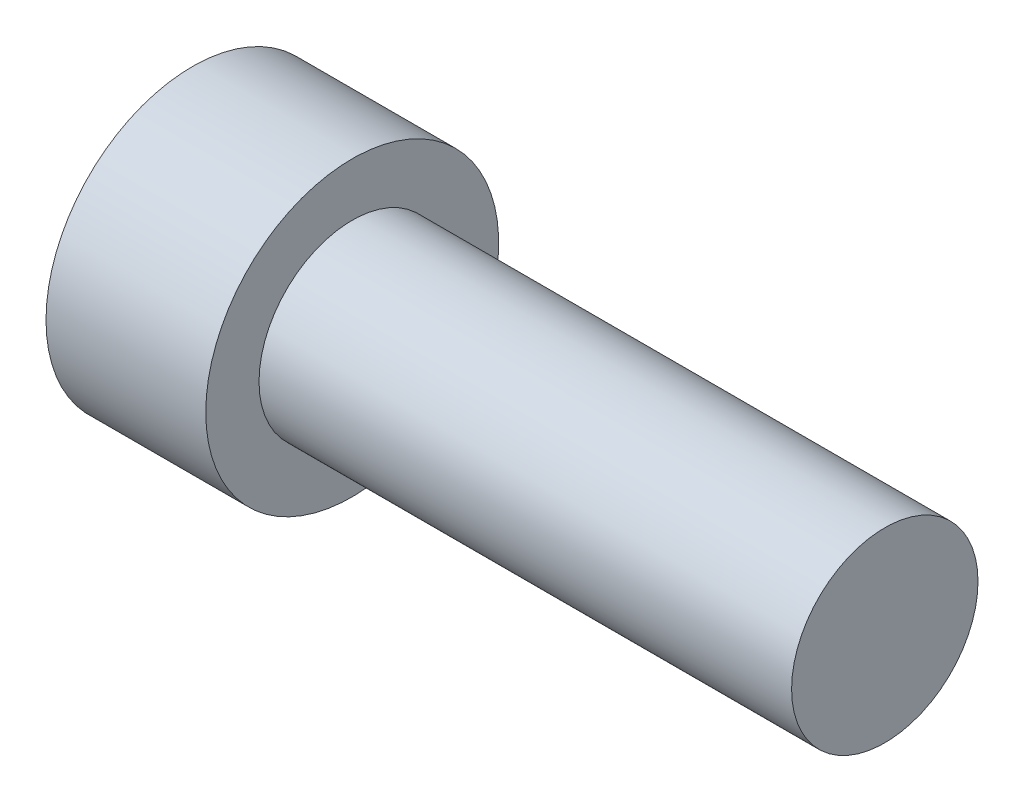
ISO-10303-21;
HEADER;
FILE_DESCRIPTION(('STEP AP214'),'2;1');
FILE_NAME('part.step','',(''),(''),'','','');
FILE_SCHEMA(('AUTOMOTIVE_DESIGN { 1 0 10303 214 1 1 1 1 }'));
ENDSEC;
DATA;
#1=APPLICATION_CONTEXT('core data for automotive mechanical design processes');
#2=APPLICATION_PROTOCOL_DEFINITION('international standard','automotive_design',2000,#1);
#3=PRODUCT_CONTEXT('',#1,'mechanical');
#4=PRODUCT('Part','Part','',(#3));
#5=PRODUCT_RELATED_PRODUCT_CATEGORY('part','',(#4));
#6=PRODUCT_DEFINITION_FORMATION('','',#4);
#7=PRODUCT_DEFINITION_CONTEXT('part definition',#1,'design');
#8=PRODUCT_DEFINITION('design','',#6,#7);
#9=PRODUCT_DEFINITION_SHAPE('','',#8);
#10=(LENGTH_UNIT() NAMED_UNIT(*) SI_UNIT(.MILLI.,.METRE.));
#11=(NAMED_UNIT(*) PLANE_ANGLE_UNIT() SI_UNIT($,.RADIAN.));
#12=(NAMED_UNIT(*) SI_UNIT($,.STERADIAN.) SOLID_ANGLE_UNIT());
#13=UNCERTAINTY_MEASURE_WITH_UNIT(LENGTH_MEASURE(1.E-05),#10,'distance_accuracy_value','');
#14=(GEOMETRIC_REPRESENTATION_CONTEXT(3) GLOBAL_UNCERTAINTY_ASSIGNED_CONTEXT((#13)) GLOBAL_UNIT_ASSIGNED_CONTEXT((#10,
#11,#12)) REPRESENTATION_CONTEXT('',''));
#15=CARTESIAN_POINT('',(0.,0.,0.));
#16=DIRECTION('',(0.,0.,1.));
#17=DIRECTION('',(1.,0.,0.));
#18=AXIS2_PLACEMENT_3D('',#15,#16,#17);
#19=CARTESIAN_POINT('',(10.,0.,0.));
#20=DIRECTION('',(-1.,0.,0.));
#21=DIRECTION('',(0.,0.,1.));
#22=AXIS2_PLACEMENT_3D('',#19,#20,#21);
#23=CYLINDRICAL_SURFACE('',#22,1.75);
#24=CARTESIAN_POINT('',(10.,0.,0.));
#25=DIRECTION('',(1.,0.,0.));
#26=DIRECTION('',(0.,0.,-1.));
#27=AXIS2_PLACEMENT_3D('',#24,#25,#26);
#28=CIRCLE('',#27,1.75);
#29=CARTESIAN_POINT('',(10.,0.,-1.75));
#30=VERTEX_POINT('',#29);
#31=EDGE_CURVE('E11',#30,#30,#28,.T.);
#32=ORIENTED_EDGE('',*,*,#31,.F.);
#33=EDGE_LOOP('',(#32));
#34=FACE_BOUND('',#33,.T.);
#35=CARTESIAN_POINT('',(0.,0.,0.));
#36=DIRECTION('',(1.,0.,0.));
#37=DIRECTION('',(0.,0.,-1.));
#38=AXIS2_PLACEMENT_3D('',#35,#36,#37);
#39=CIRCLE('',#38,1.75);
#40=CARTESIAN_POINT('',(0.,0.,-1.75));
#41=VERTEX_POINT('',#40);
#42=EDGE_CURVE('E37',#41,#41,#39,.T.);
#43=ORIENTED_EDGE('',*,*,#42,.T.);
#44=EDGE_LOOP('',(#43));
#45=FACE_BOUND('',#44,.T.);
#46=ADVANCED_FACE('F34',(#34,#45),#23,.T.);
#47=CARTESIAN_POINT('',(10.,0.,0.));
#48=DIRECTION('',(1.,0.,0.));
#49=DIRECTION('',(0.,0.,-1.));
#50=AXIS2_PLACEMENT_3D('',#47,#48,#49);
#51=PLANE('',#50);
#52=ORIENTED_EDGE('',*,*,#31,.T.);
#53=EDGE_LOOP('',(#52));
#54=FACE_BOUND('',#53,.T.);
#55=ADVANCED_FACE('F166',(#54),#51,.T.);
#56=CARTESIAN_POINT('',(-3.,0.,0.));
#57=DIRECTION('',(1.,0.,0.));
#58=DIRECTION('',(0.,0.,-1.));
#59=AXIS2_PLACEMENT_3D('',#56,#57,#58);
#60=CYLINDRICAL_SURFACE('',#59,2.75);
#61=CARTESIAN_POINT('',(-3.,0.,0.));
#62=DIRECTION('',(-1.,0.,0.));
#63=DIRECTION('',(0.,0.,1.));
#64=AXIS2_PLACEMENT_3D('',#61,#62,#63);
#65=CIRCLE('',#64,2.75);
#66=CARTESIAN_POINT('',(-3.,0.,2.75));
#67=VERTEX_POINT('',#66);
#68=EDGE_CURVE('E141',#67,#67,#65,.T.);
#69=ORIENTED_EDGE('',*,*,#68,.F.);
#70=EDGE_LOOP('',(#69));
#71=FACE_BOUND('',#70,.T.);
#72=CARTESIAN_POINT('',(0.,0.,0.));
#73=DIRECTION('',(-1.,0.,0.));
#74=DIRECTION('',(0.,0.,1.));
#75=AXIS2_PLACEMENT_3D('',#72,#73,#74);
#76=CIRCLE('',#75,2.75);
#77=CARTESIAN_POINT('',(0.,0.,2.75));
#78=VERTEX_POINT('',#77);
#79=EDGE_CURVE('E135',#78,#78,#76,.T.);
#80=ORIENTED_EDGE('',*,*,#79,.T.);
#81=EDGE_LOOP('',(#80));
#82=FACE_BOUND('',#81,.T.);
#83=ADVANCED_FACE('F147',(#71,#82),#60,.T.);
#84=CARTESIAN_POINT('',(-3.,0.,0.));
#85=DIRECTION('',(-1.,0.,0.));
#86=DIRECTION('',(0.,0.,1.));
#87=AXIS2_PLACEMENT_3D('',#84,#85,#86);
#88=PLANE('',#87);
#89=DIRECTION('',(0.,0.5,0.866025403784439));
#90=VECTOR('',#89,1.);
#91=CARTESIAN_POINT('',(-3.,-1.44337567297406,0.));
#92=LINE('',#91,#90);
#93=CARTESIAN_POINT('',(-3.,-1.44337567297406,0.));
#94=VERTEX_POINT('',#93);
#95=CARTESIAN_POINT('',(-3.,-0.721687836487033,1.25));
#96=VERTEX_POINT('',#95);
#97=EDGE_CURVE('E48',#94,#96,#92,.T.);
#98=ORIENTED_EDGE('',*,*,#97,.F.);
#99=DIRECTION('',(0.,-0.5,0.866025403784439));
#100=VECTOR('',#99,1.);
#101=CARTESIAN_POINT('',(-3.,-0.721687836487032,-1.25));
#102=LINE('',#101,#100);
#103=CARTESIAN_POINT('',(-3.,-0.721687836487032,-1.25));
#104=VERTEX_POINT('',#103);
#105=EDGE_CURVE('E131',#104,#94,#102,.T.);
#106=ORIENTED_EDGE('',*,*,#105,.F.);
#107=DIRECTION('',(0.,-1.,0.));
#108=VECTOR('',#107,1.);
#109=CARTESIAN_POINT('',(-3.,0.721687836487033,-1.25));
#110=LINE('',#109,#108);
#111=CARTESIAN_POINT('',(-3.,0.721687836487033,-1.25));
#112=VERTEX_POINT('',#111);
#113=EDGE_CURVE('E129',#112,#104,#110,.T.);
#114=ORIENTED_EDGE('',*,*,#113,.F.);
#115=DIRECTION('',(0.,-0.5,-0.866025403784439));
#116=VECTOR('',#115,1.);
#117=CARTESIAN_POINT('',(-3.,1.44337567297407,0.));
#118=LINE('',#117,#116);
#119=CARTESIAN_POINT('',(-3.,1.44337567297407,0.));
#120=VERTEX_POINT('',#119);
#121=EDGE_CURVE('E96',#120,#112,#118,.T.);
#122=ORIENTED_EDGE('',*,*,#121,.F.);
#123=DIRECTION('',(0.,0.5,-0.866025403784439));
#124=VECTOR('',#123,1.);
#125=CARTESIAN_POINT('',(-3.,0.721687836487033,1.25));
#126=LINE('',#125,#124);
#127=CARTESIAN_POINT('',(-3.,0.721687836487033,1.25));
#128=VERTEX_POINT('',#127);
#129=EDGE_CURVE('E125',#128,#120,#126,.T.);
#130=ORIENTED_EDGE('',*,*,#129,.F.);
#131=DIRECTION('',(0.,1.,0.));
#132=VECTOR('',#131,1.);
#133=CARTESIAN_POINT('',(-3.,-0.721687836487033,1.25));
#134=LINE('',#133,#132);
#135=EDGE_CURVE('E122',#96,#128,#134,.T.);
#136=ORIENTED_EDGE('',*,*,#135,.F.);
#137=EDGE_LOOP('',(#98,#106,#114,#122,#130,#136));
#138=FACE_BOUND('',#137,.T.);
#139=ORIENTED_EDGE('',*,*,#68,.T.);
#140=EDGE_LOOP('',(#139));
#141=FACE_BOUND('',#140,.T.);
#142=ADVANCED_FACE('F152',(#138,#141),#88,.T.);
#143=CARTESIAN_POINT('',(0.,0.,0.));
#144=DIRECTION('',(-1.,0.,0.));
#145=DIRECTION('',(0.,0.,1.));
#146=AXIS2_PLACEMENT_3D('',#143,#144,#145);
#147=PLANE('',#146);
#148=ORIENTED_EDGE('',*,*,#42,.F.);
#149=EDGE_LOOP('',(#148));
#150=FACE_BOUND('',#149,.T.);
#151=ORIENTED_EDGE('',*,*,#79,.F.);
#152=EDGE_LOOP('',(#151));
#153=FACE_BOUND('',#152,.T.);
#154=ADVANCED_FACE('F149',(#150,#153),#147,.F.);
#155=CARTESIAN_POINT('',(-1.,-1.44337567297406,0.));
#156=DIRECTION('',(0.,-0.866025403784439,0.5));
#157=DIRECTION('',(0.,-0.5,-0.866025403784439));
#158=AXIS2_PLACEMENT_3D('',#155,#156,#157);
#159=PLANE('',#158);
#160=ORIENTED_EDGE('',*,*,#97,.T.);
#161=DIRECTION('',(-1.,0.,0.));
#162=VECTOR('',#161,1.);
#163=CARTESIAN_POINT('',(-1.,-0.721687836487033,1.25));
#164=LINE('',#163,#162);
#165=CARTESIAN_POINT('',(-1.,-0.721687836487033,1.25));
#166=VERTEX_POINT('',#165);
#167=EDGE_CURVE('E78',#166,#96,#164,.T.);
#168=ORIENTED_EDGE('',*,*,#167,.F.);
#169=DIRECTION('',(0.,0.5,0.866025403784439));
#170=VECTOR('',#169,1.);
#171=CARTESIAN_POINT('',(-1.,-1.44337567297406,0.));
#172=LINE('',#171,#170);
#173=CARTESIAN_POINT('',(-1.,-1.44337567297406,0.));
#174=VERTEX_POINT('',#173);
#175=EDGE_CURVE('E133',#174,#166,#172,.T.);
#176=ORIENTED_EDGE('',*,*,#175,.F.);
#177=DIRECTION('',(-1.,0.,0.));
#178=VECTOR('',#177,1.);
#179=CARTESIAN_POINT('',(-1.,-1.44337567297406,0.));
#180=LINE('',#179,#178);
#181=EDGE_CURVE('E56',#174,#94,#180,.T.);
#182=ORIENTED_EDGE('',*,*,#181,.T.);
#183=EDGE_LOOP('',(#160,#168,#176,#182));
#184=FACE_BOUND('',#183,.T.);
#185=ADVANCED_FACE('F151',(#184),#159,.F.);
#186=CARTESIAN_POINT('',(-1.,-0.721687836487032,-1.25));
#187=DIRECTION('',(0.,-0.866025403784439,-0.5));
#188=DIRECTION('',(0.,0.5,-0.866025403784439));
#189=AXIS2_PLACEMENT_3D('',#186,#187,#188);
#190=PLANE('',#189);
#191=ORIENTED_EDGE('',*,*,#105,.T.);
#192=ORIENTED_EDGE('',*,*,#181,.F.);
#193=DIRECTION('',(0.,-0.5,0.866025403784439));
#194=VECTOR('',#193,1.);
#195=CARTESIAN_POINT('',(-1.,-0.721687836487032,-1.25));
#196=LINE('',#195,#194);
#197=CARTESIAN_POINT('',(-1.,-0.721687836487032,-1.25));
#198=VERTEX_POINT('',#197);
#199=EDGE_CURVE('E108',#198,#174,#196,.T.);
#200=ORIENTED_EDGE('',*,*,#199,.F.);
#201=DIRECTION('',(-1.,0.,0.));
#202=VECTOR('',#201,1.);
#203=CARTESIAN_POINT('',(-1.,-0.721687836487032,-1.25));
#204=LINE('',#203,#202);
#205=EDGE_CURVE('E100',#198,#104,#204,.T.);
#206=ORIENTED_EDGE('',*,*,#205,.T.);
#207=EDGE_LOOP('',(#191,#192,#200,#206));
#208=FACE_BOUND('',#207,.T.);
#209=ADVANCED_FACE('F159',(#208),#190,.F.);
#210=CARTESIAN_POINT('',(-1.,0.721687836487033,-1.25));
#211=DIRECTION('',(0.,0.,-1.));
#212=DIRECTION('',(-1.,0.,0.));
#213=AXIS2_PLACEMENT_3D('',#210,#211,#212);
#214=PLANE('',#213);
#215=ORIENTED_EDGE('',*,*,#113,.T.);
#216=ORIENTED_EDGE('',*,*,#205,.F.);
#217=DIRECTION('',(0.,-1.,0.));
#218=VECTOR('',#217,1.);
#219=CARTESIAN_POINT('',(-1.,0.721687836487033,-1.25));
#220=LINE('',#219,#218);
#221=CARTESIAN_POINT('',(-1.,0.721687836487033,-1.25));
#222=VERTEX_POINT('',#221);
#223=EDGE_CURVE('E104',#222,#198,#220,.T.);
#224=ORIENTED_EDGE('',*,*,#223,.F.);
#225=DIRECTION('',(-1.,0.,0.));
#226=VECTOR('',#225,1.);
#227=CARTESIAN_POINT('',(-1.,0.721687836487033,-1.25));
#228=LINE('',#227,#226);
#229=EDGE_CURVE('E89',#222,#112,#228,.T.);
#230=ORIENTED_EDGE('',*,*,#229,.T.);
#231=EDGE_LOOP('',(#215,#216,#224,#230));
#232=FACE_BOUND('',#231,.T.);
#233=ADVANCED_FACE('F105',(#232),#214,.F.);
#234=CARTESIAN_POINT('',(-1.,1.44337567297407,0.));
#235=DIRECTION('',(0.,0.866025403784439,-0.5));
#236=DIRECTION('',(0.,0.5,0.866025403784439));
#237=AXIS2_PLACEMENT_3D('',#234,#235,#236);
#238=PLANE('',#237);
#239=ORIENTED_EDGE('',*,*,#121,.T.);
#240=ORIENTED_EDGE('',*,*,#229,.F.);
#241=DIRECTION('',(0.,-0.5,-0.866025403784439));
#242=VECTOR('',#241,1.);
#243=CARTESIAN_POINT('',(-1.,1.44337567297407,0.));
#244=LINE('',#243,#242);
#245=CARTESIAN_POINT('',(-1.,1.44337567297407,0.));
#246=VERTEX_POINT('',#245);
#247=EDGE_CURVE('E93',#246,#222,#244,.T.);
#248=ORIENTED_EDGE('',*,*,#247,.F.);
#249=DIRECTION('',(-1.,0.,0.));
#250=VECTOR('',#249,1.);
#251=CARTESIAN_POINT('',(-1.,1.44337567297407,0.));
#252=LINE('',#251,#250);
#253=EDGE_CURVE('E101',#246,#120,#252,.T.);
#254=ORIENTED_EDGE('',*,*,#253,.T.);
#255=EDGE_LOOP('',(#239,#240,#248,#254));
#256=FACE_BOUND('',#255,.T.);
#257=ADVANCED_FACE('F91',(#256),#238,.F.);
#258=CARTESIAN_POINT('',(-1.,0.721687836487033,1.25));
#259=DIRECTION('',(0.,0.866025403784439,0.5));
#260=DIRECTION('',(0.,-0.5,0.866025403784439));
#261=AXIS2_PLACEMENT_3D('',#258,#259,#260);
#262=PLANE('',#261);
#263=ORIENTED_EDGE('',*,*,#129,.T.);
#264=ORIENTED_EDGE('',*,*,#253,.F.);
#265=DIRECTION('',(0.,0.5,-0.866025403784439));
#266=VECTOR('',#265,1.);
#267=CARTESIAN_POINT('',(-1.,0.721687836487033,1.25));
#268=LINE('',#267,#266);
#269=CARTESIAN_POINT('',(-1.,0.721687836487033,1.25));
#270=VERTEX_POINT('',#269);
#271=EDGE_CURVE('E114',#270,#246,#268,.T.);
#272=ORIENTED_EDGE('',*,*,#271,.F.);
#273=DIRECTION('',(-1.,0.,0.));
#274=VECTOR('',#273,1.);
#275=CARTESIAN_POINT('',(-1.,0.721687836487033,1.25));
#276=LINE('',#275,#274);
#277=EDGE_CURVE('E138',#270,#128,#276,.T.);
#278=ORIENTED_EDGE('',*,*,#277,.T.);
#279=EDGE_LOOP('',(#263,#264,#272,#278));
#280=FACE_BOUND('',#279,.T.);
#281=ADVANCED_FACE('F220',(#280),#262,.F.);
#282=CARTESIAN_POINT('',(-1.,-0.721687836487033,1.25));
#283=DIRECTION('',(0.,0.,1.));
#284=DIRECTION('',(1.,0.,0.));
#285=AXIS2_PLACEMENT_3D('',#282,#283,#284);
#286=PLANE('',#285);
#287=ORIENTED_EDGE('',*,*,#135,.T.);
#288=ORIENTED_EDGE('',*,*,#277,.F.);
#289=DIRECTION('',(0.,1.,0.));
#290=VECTOR('',#289,1.);
#291=CARTESIAN_POINT('',(-1.,-0.721687836487033,1.25));
#292=LINE('',#291,#290);
#293=EDGE_CURVE('E116',#166,#270,#292,.T.);
#294=ORIENTED_EDGE('',*,*,#293,.F.);
#295=ORIENTED_EDGE('',*,*,#167,.T.);
#296=EDGE_LOOP('',(#287,#288,#294,#295));
#297=FACE_BOUND('',#296,.T.);
#298=ADVANCED_FACE('F229',(#297),#286,.F.);
#299=CARTESIAN_POINT('',(-1.,0.,0.));
#300=DIRECTION('',(-1.,0.,0.));
#301=DIRECTION('',(0.,0.,1.));
#302=AXIS2_PLACEMENT_3D('',#299,#300,#301);
#303=PLANE('',#302);
#304=ORIENTED_EDGE('',*,*,#175,.T.);
#305=ORIENTED_EDGE('',*,*,#293,.T.);
#306=ORIENTED_EDGE('',*,*,#271,.T.);
#307=ORIENTED_EDGE('',*,*,#247,.T.);
#308=ORIENTED_EDGE('',*,*,#223,.T.);
#309=ORIENTED_EDGE('',*,*,#199,.T.);
#310=EDGE_LOOP('',(#304,#305,#306,#307,#308,#309));
#311=FACE_BOUND('',#310,.T.);
#312=ADVANCED_FACE('F111',(#311),#303,.T.);
#313=CLOSED_SHELL('',(#46,#55,#83,#142,#154,#185,#209,#233,#257,#281,#298,#312));
#314=MANIFOLD_SOLID_BREP('B2',#313);
#315=ADVANCED_BREP_SHAPE_REPRESENTATION('',(#18,#314),#14);
#316=SHAPE_DEFINITION_REPRESENTATION(#9,#315);
ENDSEC;
END-ISO-10303-21;
